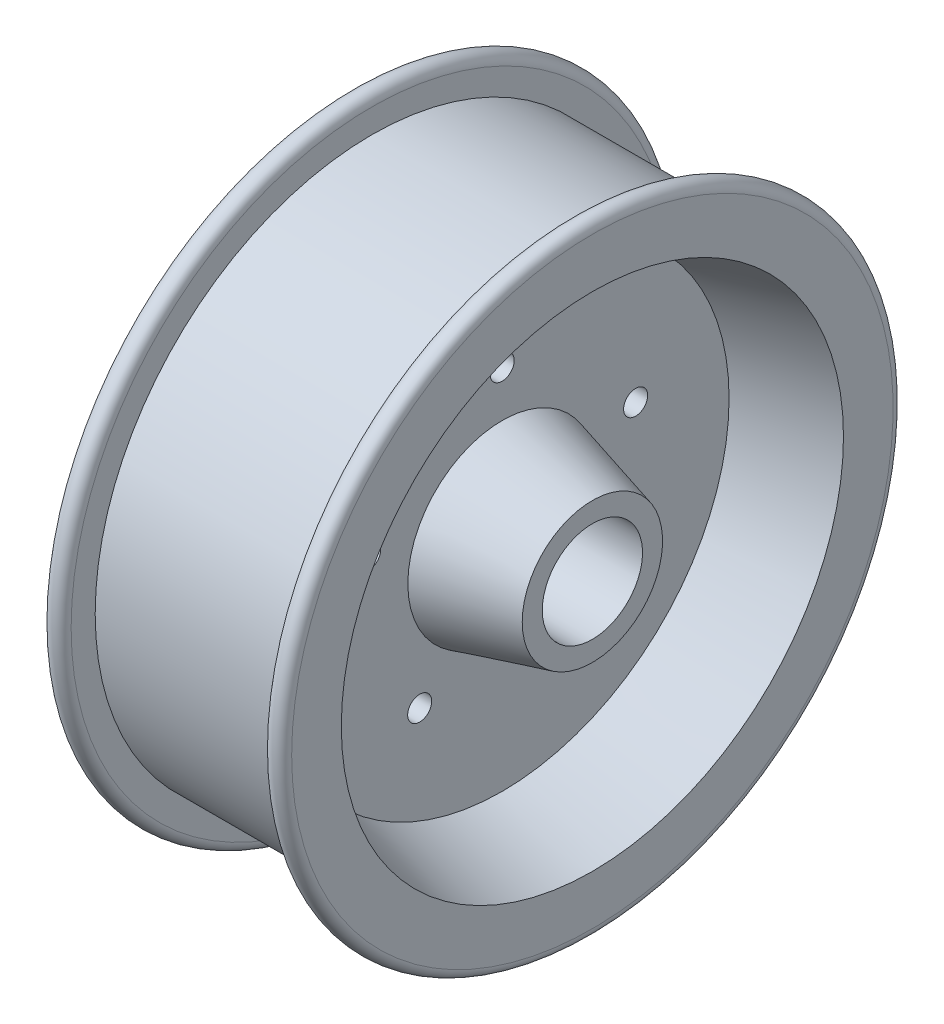
ISO-10303-21;
HEADER;
FILE_DESCRIPTION(('STEP AP214'),'2;1');
FILE_NAME('part.step','',(''),(''),'','','');
FILE_SCHEMA(('AUTOMOTIVE_DESIGN { 1 0 10303 214 1 1 1 1 }'));
ENDSEC;
DATA;
#1=APPLICATION_CONTEXT('core data for automotive mechanical design processes');
#2=APPLICATION_PROTOCOL_DEFINITION('international standard','automotive_design',2000,#1);
#3=PRODUCT_CONTEXT('',#1,'mechanical');
#4=PRODUCT('Part','Part','',(#3));
#5=PRODUCT_RELATED_PRODUCT_CATEGORY('part','',(#4));
#6=PRODUCT_DEFINITION_FORMATION('','',#4);
#7=PRODUCT_DEFINITION_CONTEXT('part definition',#1,'design');
#8=PRODUCT_DEFINITION('design','',#6,#7);
#9=PRODUCT_DEFINITION_SHAPE('','',#8);
#10=(LENGTH_UNIT() NAMED_UNIT(*) SI_UNIT(.MILLI.,.METRE.));
#11=(NAMED_UNIT(*) PLANE_ANGLE_UNIT() SI_UNIT($,.RADIAN.));
#12=(NAMED_UNIT(*) SI_UNIT($,.STERADIAN.) SOLID_ANGLE_UNIT());
#13=UNCERTAINTY_MEASURE_WITH_UNIT(LENGTH_MEASURE(1.E-05),#10,'distance_accuracy_value','');
#14=(GEOMETRIC_REPRESENTATION_CONTEXT(3) GLOBAL_UNCERTAINTY_ASSIGNED_CONTEXT((#13)) GLOBAL_UNIT_ASSIGNED_CONTEXT((#10,
#11,#12)) REPRESENTATION_CONTEXT('',''));
#15=CARTESIAN_POINT('',(0.,0.,0.));
#16=DIRECTION('',(0.,0.,1.));
#17=DIRECTION('',(1.,0.,0.));
#18=AXIS2_PLACEMENT_3D('',#15,#16,#17);
#19=CARTESIAN_POINT('',(-34.925,0.,0.));
#20=DIRECTION('',(-1.,0.,0.));
#21=DIRECTION('',(0.,0.,1.));
#22=AXIS2_PLACEMENT_3D('',#19,#20,#21);
#23=TOROIDAL_SURFACE('',#22,95.25,3.175);
#24=CARTESIAN_POINT('',(-31.75,0.,0.));
#25=DIRECTION('',(-1.,0.,0.));
#26=DIRECTION('',(0.,0.,1.));
#27=AXIS2_PLACEMENT_3D('',#24,#25,#26);
#28=CIRCLE('',#27,95.25);
#29=CARTESIAN_POINT('',(-31.75,0.,95.25));
#30=VERTEX_POINT('',#29);
#31=EDGE_CURVE('E108',#30,#30,#28,.T.);
#32=ORIENTED_EDGE('',*,*,#31,.T.);
#33=EDGE_LOOP('',(#32));
#34=FACE_BOUND('',#33,.T.);
#35=CARTESIAN_POINT('',(-38.1,0.,0.));
#36=DIRECTION('',(-1.,0.,0.));
#37=DIRECTION('',(0.,0.,1.));
#38=AXIS2_PLACEMENT_3D('',#35,#36,#37);
#39=CIRCLE('',#38,95.25);
#40=CARTESIAN_POINT('',(-38.1,0.,95.25));
#41=VERTEX_POINT('',#40);
#42=EDGE_CURVE('E10',#41,#41,#39,.T.);
#43=ORIENTED_EDGE('',*,*,#42,.F.);
#44=EDGE_LOOP('',(#43));
#45=FACE_BOUND('',#44,.T.);
#46=ADVANCED_FACE('F41',(#34,#45),#23,.T.);
#47=CARTESIAN_POINT('',(-38.1,0.,0.));
#48=DIRECTION('',(-1.,0.,0.));
#49=DIRECTION('',(0.,0.,1.));
#50=AXIS2_PLACEMENT_3D('',#47,#48,#49);
#51=PLANE('',#50);
#52=ORIENTED_EDGE('',*,*,#42,.T.);
#53=EDGE_LOOP('',(#52));
#54=FACE_BOUND('',#53,.T.);
#55=CARTESIAN_POINT('',(-38.1,0.,0.));
#56=DIRECTION('',(-1.,0.,0.));
#57=DIRECTION('',(0.,0.,1.));
#58=AXIS2_PLACEMENT_3D('',#55,#56,#57);
#59=CIRCLE('',#58,79.5274);
#60=CARTESIAN_POINT('',(-38.1,0.,79.5274));
#61=VERTEX_POINT('',#60);
#62=EDGE_CURVE('E48',#61,#61,#59,.T.);
#63=ORIENTED_EDGE('',*,*,#62,.F.);
#64=EDGE_LOOP('',(#63));
#65=FACE_BOUND('',#64,.T.);
#66=ADVANCED_FACE('F202',(#54,#65),#51,.T.);
#67=CARTESIAN_POINT('',(-9.52500000000001,0.,0.));
#68=DIRECTION('',(-1.,0.,0.));
#69=DIRECTION('',(0.,0.,1.));
#70=AXIS2_PLACEMENT_3D('',#67,#68,#69);
#71=CONICAL_SURFACE('',#70,71.8707518262806,0.26179938779915);
#72=ORIENTED_EDGE('',*,*,#62,.T.);
#73=EDGE_LOOP('',(#72));
#74=FACE_BOUND('',#73,.T.);
#75=CARTESIAN_POINT('',(-9.52500000000001,0.,0.));
#76=DIRECTION('',(-1.,0.,0.));
#77=DIRECTION('',(0.,0.,1.));
#78=AXIS2_PLACEMENT_3D('',#75,#76,#77);
#79=CIRCLE('',#78,71.8707518262806);
#80=CARTESIAN_POINT('',(-9.52500000000001,0.,71.8707518262806));
#81=VERTEX_POINT('',#80);
#82=EDGE_CURVE('E53',#81,#81,#79,.T.);
#83=ORIENTED_EDGE('',*,*,#82,.F.);
#84=EDGE_LOOP('',(#83));
#85=FACE_BOUND('',#84,.T.);
#86=ADVANCED_FACE('F207',(#74,#85),#71,.F.);
#87=CARTESIAN_POINT('',(-9.525,0.,0.));
#88=DIRECTION('',(-1.,0.,0.));
#89=DIRECTION('',(0.,0.,1.));
#90=AXIS2_PLACEMENT_3D('',#87,#88,#89);
#91=PLANE('',#90);
#92=CARTESIAN_POINT('',(-9.525,44.45,0.));
#93=DIRECTION('',(-1.,0.,0.));
#94=DIRECTION('',(0.,0.,1.));
#95=AXIS2_PLACEMENT_3D('',#92,#93,#94);
#96=CIRCLE('',#95,3.81);
#97=CARTESIAN_POINT('',(-9.525,44.45,3.81));
#98=VERTEX_POINT('',#97);
#99=EDGE_CURVE('E112',#98,#98,#96,.T.);
#100=ORIENTED_EDGE('',*,*,#99,.F.);
#101=EDGE_LOOP('',(#100));
#102=FACE_BOUND('',#101,.T.);
#103=CARTESIAN_POINT('',(-9.525,13.7358053999664,-42.2744621493196));
#104=DIRECTION('',(-1.,0.,0.));
#105=DIRECTION('',(0.,0.,1.));
#106=AXIS2_PLACEMENT_3D('',#103,#104,#105);
#107=CIRCLE('',#106,3.81);
#108=CARTESIAN_POINT('',(-9.525,13.7358053999664,-38.4644621493196));
#109=VERTEX_POINT('',#108);
#110=EDGE_CURVE('E116',#109,#109,#107,.T.);
#111=ORIENTED_EDGE('',*,*,#110,.F.);
#112=EDGE_LOOP('',(#111));
#113=FACE_BOUND('',#112,.T.);
#114=CARTESIAN_POINT('',(-9.525,-35.9608053999664,-26.1270544644004));
#115=DIRECTION('',(-1.,0.,0.));
#116=DIRECTION('',(0.,0.,1.));
#117=AXIS2_PLACEMENT_3D('',#114,#115,#116);
#118=CIRCLE('',#117,3.81);
#119=CARTESIAN_POINT('',(-9.525,-35.9608053999664,-22.3170544644004));
#120=VERTEX_POINT('',#119);
#121=EDGE_CURVE('E120',#120,#120,#118,.T.);
#122=ORIENTED_EDGE('',*,*,#121,.F.);
#123=EDGE_LOOP('',(#122));
#124=FACE_BOUND('',#123,.T.);
#125=CARTESIAN_POINT('',(-9.525,-35.9608053999664,26.1270544644004));
#126=DIRECTION('',(-1.,0.,0.));
#127=DIRECTION('',(0.,0.,1.));
#128=AXIS2_PLACEMENT_3D('',#125,#126,#127);
#129=CIRCLE('',#128,3.81);
#130=CARTESIAN_POINT('',(-9.525,-35.9608053999664,29.9370544644004));
#131=VERTEX_POINT('',#130);
#132=EDGE_CURVE('E124',#131,#131,#129,.T.);
#133=ORIENTED_EDGE('',*,*,#132,.F.);
#134=EDGE_LOOP('',(#133));
#135=FACE_BOUND('',#134,.T.);
#136=CARTESIAN_POINT('',(-9.525,13.7358053999664,42.2744621493196));
#137=DIRECTION('',(-1.,0.,0.));
#138=DIRECTION('',(0.,0.,1.));
#139=AXIS2_PLACEMENT_3D('',#136,#137,#138);
#140=CIRCLE('',#139,3.80999999999999);
#141=CARTESIAN_POINT('',(-9.525,13.7358053999664,46.0844621493196));
#142=VERTEX_POINT('',#141);
#143=EDGE_CURVE('E128',#142,#142,#140,.T.);
#144=ORIENTED_EDGE('',*,*,#143,.F.);
#145=EDGE_LOOP('',(#144));
#146=FACE_BOUND('',#145,.T.);
#147=ORIENTED_EDGE('',*,*,#82,.T.);
#148=EDGE_LOOP('',(#147));
#149=FACE_BOUND('',#148,.T.);
#150=CARTESIAN_POINT('',(-9.52499999999999,0.,0.));
#151=DIRECTION('',(-1.,0.,0.));
#152=DIRECTION('',(0.,0.,1.));
#153=AXIS2_PLACEMENT_3D('',#150,#151,#152);
#154=CIRCLE('',#153,29.8816481737194);
#155=CARTESIAN_POINT('',(-9.52499999999999,0.,29.8816481737194));
#156=VERTEX_POINT('',#155);
#157=EDGE_CURVE('E58',#156,#156,#154,.T.);
#158=ORIENTED_EDGE('',*,*,#157,.F.);
#159=EDGE_LOOP('',(#158));
#160=FACE_BOUND('',#159,.T.);
#161=ADVANCED_FACE('F198',(#102,#113,#124,#135,#146,#149,#160),#91,.T.);
#162=CARTESIAN_POINT('',(-38.1,0.,0.));
#163=DIRECTION('',(1.,0.,0.));
#164=DIRECTION('',(0.,0.,-1.));
#165=AXIS2_PLACEMENT_3D('',#162,#163,#164);
#166=CONICAL_SURFACE('',#165,22.225,0.26179938779915);
#167=ORIENTED_EDGE('',*,*,#157,.T.);
#168=EDGE_LOOP('',(#167));
#169=FACE_BOUND('',#168,.T.);
#170=CARTESIAN_POINT('',(-38.1,0.,0.));
#171=DIRECTION('',(-1.,0.,0.));
#172=DIRECTION('',(0.,0.,1.));
#173=AXIS2_PLACEMENT_3D('',#170,#171,#172);
#174=CIRCLE('',#173,22.225);
#175=CARTESIAN_POINT('',(-38.1,0.,22.225));
#176=VERTEX_POINT('',#175);
#177=EDGE_CURVE('E64',#176,#176,#174,.T.);
#178=ORIENTED_EDGE('',*,*,#177,.F.);
#179=EDGE_LOOP('',(#178));
#180=FACE_BOUND('',#179,.T.);
#181=ADVANCED_FACE('F192',(#169,#180),#166,.T.);
#182=CARTESIAN_POINT('',(-38.1,0.,0.));
#183=DIRECTION('',(-1.,0.,0.));
#184=DIRECTION('',(0.,0.,1.));
#185=AXIS2_PLACEMENT_3D('',#182,#183,#184);
#186=PLANE('',#185);
#187=ORIENTED_EDGE('',*,*,#177,.T.);
#188=EDGE_LOOP('',(#187));
#189=FACE_BOUND('',#188,.T.);
#190=CARTESIAN_POINT('',(-38.1,0.,0.));
#191=DIRECTION('',(-1.,0.,0.));
#192=DIRECTION('',(0.,0.,1.));
#193=AXIS2_PLACEMENT_3D('',#190,#191,#192);
#194=CIRCLE('',#193,15.875);
#195=CARTESIAN_POINT('',(-38.1,0.,15.875));
#196=VERTEX_POINT('',#195);
#197=EDGE_CURVE('E68',#196,#196,#194,.T.);
#198=ORIENTED_EDGE('',*,*,#197,.F.);
#199=EDGE_LOOP('',(#198));
#200=FACE_BOUND('',#199,.T.);
#201=ADVANCED_FACE('F187',(#189,#200),#186,.T.);
#202=CARTESIAN_POINT('',(-74.7676691729323,0.,0.));
#203=DIRECTION('',(-1.,0.,0.));
#204=DIRECTION('',(0.,0.,1.));
#205=AXIS2_PLACEMENT_3D('',#202,#203,#204);
#206=CYLINDRICAL_SURFACE('',#205,15.875);
#207=CARTESIAN_POINT('',(38.1,0.,0.));
#208=DIRECTION('',(-1.,0.,0.));
#209=DIRECTION('',(0.,0.,1.));
#210=AXIS2_PLACEMENT_3D('',#207,#208,#209);
#211=CIRCLE('',#210,15.875);
#212=CARTESIAN_POINT('',(38.1,0.,15.875));
#213=VERTEX_POINT('',#212);
#214=EDGE_CURVE('E72',#213,#213,#211,.T.);
#215=ORIENTED_EDGE('',*,*,#214,.F.);
#216=EDGE_LOOP('',(#215));
#217=FACE_BOUND('',#216,.T.);
#218=ORIENTED_EDGE('',*,*,#197,.T.);
#219=EDGE_LOOP('',(#218));
#220=FACE_BOUND('',#219,.T.);
#221=ADVANCED_FACE('F181',(#217,#220),#206,.F.);
#222=CARTESIAN_POINT('',(38.1,0.,0.));
#223=DIRECTION('',(-1.,0.,0.));
#224=DIRECTION('',(0.,0.,1.));
#225=AXIS2_PLACEMENT_3D('',#222,#223,#224);
#226=PLANE('',#225);
#227=CARTESIAN_POINT('',(38.1,0.,0.));
#228=DIRECTION('',(-1.,0.,0.));
#229=DIRECTION('',(0.,0.,1.));
#230=AXIS2_PLACEMENT_3D('',#227,#228,#229);
#231=CIRCLE('',#230,22.225);
#232=CARTESIAN_POINT('',(38.1,0.,22.225));
#233=VERTEX_POINT('',#232);
#234=EDGE_CURVE('E76',#233,#233,#231,.T.);
#235=ORIENTED_EDGE('',*,*,#234,.F.);
#236=EDGE_LOOP('',(#235));
#237=FACE_BOUND('',#236,.T.);
#238=ORIENTED_EDGE('',*,*,#214,.T.);
#239=EDGE_LOOP('',(#238));
#240=FACE_BOUND('',#239,.T.);
#241=ADVANCED_FACE('F175',(#237,#240),#226,.F.);
#242=CARTESIAN_POINT('',(38.1,0.,0.));
#243=DIRECTION('',(-1.,0.,0.));
#244=DIRECTION('',(0.,0.,1.));
#245=AXIS2_PLACEMENT_3D('',#242,#243,#244);
#246=CONICAL_SURFACE('',#245,22.225,0.26179938779915);
#247=CARTESIAN_POINT('',(9.52500000000001,0.,0.));
#248=DIRECTION('',(-1.,0.,0.));
#249=DIRECTION('',(0.,0.,1.));
#250=AXIS2_PLACEMENT_3D('',#247,#248,#249);
#251=CIRCLE('',#250,29.8816481737194);
#252=CARTESIAN_POINT('',(9.52500000000001,0.,29.8816481737194));
#253=VERTEX_POINT('',#252);
#254=EDGE_CURVE('E80',#253,#253,#251,.T.);
#255=ORIENTED_EDGE('',*,*,#254,.F.);
#256=EDGE_LOOP('',(#255));
#257=FACE_BOUND('',#256,.T.);
#258=ORIENTED_EDGE('',*,*,#234,.T.);
#259=EDGE_LOOP('',(#258));
#260=FACE_BOUND('',#259,.T.);
#261=ADVANCED_FACE('F159',(#257,#260),#246,.T.);
#262=CARTESIAN_POINT('',(9.52500000000001,0.,0.));
#263=DIRECTION('',(-1.,0.,0.));
#264=DIRECTION('',(0.,0.,1.));
#265=AXIS2_PLACEMENT_3D('',#262,#263,#264);
#266=PLANE('',#265);
#267=CARTESIAN_POINT('',(9.52500000000001,44.45,0.));
#268=DIRECTION('',(1.,0.,0.));
#269=DIRECTION('',(0.,0.,-1.));
#270=AXIS2_PLACEMENT_3D('',#267,#268,#269);
#271=CIRCLE('',#270,3.81);
#272=CARTESIAN_POINT('',(9.52500000000001,44.45,-3.81));
#273=VERTEX_POINT('',#272);
#274=EDGE_CURVE('E132',#273,#273,#271,.T.);
#275=ORIENTED_EDGE('',*,*,#274,.F.);
#276=EDGE_LOOP('',(#275));
#277=FACE_BOUND('',#276,.T.);
#278=CARTESIAN_POINT('',(9.52500000000001,13.7358053999664,-42.2744621493196));
#279=DIRECTION('',(1.,0.,0.));
#280=DIRECTION('',(0.,0.,-1.));
#281=AXIS2_PLACEMENT_3D('',#278,#279,#280);
#282=CIRCLE('',#281,3.81);
#283=CARTESIAN_POINT('',(9.52500000000001,13.7358053999664,-46.0844621493196));
#284=VERTEX_POINT('',#283);
#285=EDGE_CURVE('E145',#284,#284,#282,.T.);
#286=ORIENTED_EDGE('',*,*,#285,.F.);
#287=EDGE_LOOP('',(#286));
#288=FACE_BOUND('',#287,.T.);
#289=CARTESIAN_POINT('',(9.52500000000001,-35.9608053999664,-26.1270544644004));
#290=DIRECTION('',(1.,0.,0.));
#291=DIRECTION('',(0.,0.,-1.));
#292=AXIS2_PLACEMENT_3D('',#289,#290,#291);
#293=CIRCLE('',#292,3.81);
#294=CARTESIAN_POINT('',(9.52500000000001,-35.9608053999664,-29.9370544644004));
#295=VERTEX_POINT('',#294);
#296=EDGE_CURVE('E141',#295,#295,#293,.T.);
#297=ORIENTED_EDGE('',*,*,#296,.F.);
#298=EDGE_LOOP('',(#297));
#299=FACE_BOUND('',#298,.T.);
#300=CARTESIAN_POINT('',(9.52500000000001,-35.9608053999664,26.1270544644004));
#301=DIRECTION('',(1.,0.,0.));
#302=DIRECTION('',(0.,0.,-1.));
#303=AXIS2_PLACEMENT_3D('',#300,#301,#302);
#304=CIRCLE('',#303,3.81);
#305=CARTESIAN_POINT('',(9.52500000000001,-35.9608053999664,22.3170544644004));
#306=VERTEX_POINT('',#305);
#307=EDGE_CURVE('E137',#306,#306,#304,.T.);
#308=ORIENTED_EDGE('',*,*,#307,.F.);
#309=EDGE_LOOP('',(#308));
#310=FACE_BOUND('',#309,.T.);
#311=CARTESIAN_POINT('',(9.52500000000001,13.7358053999664,42.2744621493196));
#312=DIRECTION('',(1.,0.,0.));
#313=DIRECTION('',(0.,0.,-1.));
#314=AXIS2_PLACEMENT_3D('',#311,#312,#313);
#315=CIRCLE('',#314,3.80999999999999);
#316=CARTESIAN_POINT('',(9.52500000000001,13.7358053999664,38.4644621493196));
#317=VERTEX_POINT('',#316);
#318=EDGE_CURVE('E133',#317,#317,#315,.T.);
#319=ORIENTED_EDGE('',*,*,#318,.F.);
#320=EDGE_LOOP('',(#319));
#321=FACE_BOUND('',#320,.T.);
#322=CARTESIAN_POINT('',(9.52500000000001,0.,0.));
#323=DIRECTION('',(-1.,0.,0.));
#324=DIRECTION('',(0.,0.,1.));
#325=AXIS2_PLACEMENT_3D('',#322,#323,#324);
#326=CIRCLE('',#325,71.8707518262807);
#327=CARTESIAN_POINT('',(9.52500000000001,0.,71.8707518262807));
#328=VERTEX_POINT('',#327);
#329=EDGE_CURVE('E84',#328,#328,#326,.T.);
#330=ORIENTED_EDGE('',*,*,#329,.F.);
#331=EDGE_LOOP('',(#330));
#332=FACE_BOUND('',#331,.T.);
#333=ORIENTED_EDGE('',*,*,#254,.T.);
#334=EDGE_LOOP('',(#333));
#335=FACE_BOUND('',#334,.T.);
#336=ADVANCED_FACE('F155',(#277,#288,#299,#310,#321,#332,#335),#266,.F.);
#337=CARTESIAN_POINT('',(9.52500000000001,0.,0.));
#338=DIRECTION('',(1.,0.,0.));
#339=DIRECTION('',(0.,0.,-1.));
#340=AXIS2_PLACEMENT_3D('',#337,#338,#339);
#341=CONICAL_SURFACE('',#340,71.8707518262807,0.26179938779915);
#342=CARTESIAN_POINT('',(38.1,0.,0.));
#343=DIRECTION('',(-1.,0.,0.));
#344=DIRECTION('',(0.,0.,1.));
#345=AXIS2_PLACEMENT_3D('',#342,#343,#344);
#346=CIRCLE('',#345,79.5274);
#347=CARTESIAN_POINT('',(38.1,0.,79.5274));
#348=VERTEX_POINT('',#347);
#349=EDGE_CURVE('E88',#348,#348,#346,.T.);
#350=ORIENTED_EDGE('',*,*,#349,.F.);
#351=EDGE_LOOP('',(#350));
#352=FACE_BOUND('',#351,.T.);
#353=ORIENTED_EDGE('',*,*,#329,.T.);
#354=EDGE_LOOP('',(#353));
#355=FACE_BOUND('',#354,.T.);
#356=ADVANCED_FACE('F158',(#352,#355),#341,.F.);
#357=CARTESIAN_POINT('',(38.1,0.,0.));
#358=DIRECTION('',(-1.,0.,0.));
#359=DIRECTION('',(0.,0.,1.));
#360=AXIS2_PLACEMENT_3D('',#357,#358,#359);
#361=PLANE('',#360);
#362=CARTESIAN_POINT('',(38.1,0.,0.));
#363=DIRECTION('',(-1.,0.,0.));
#364=DIRECTION('',(0.,0.,1.));
#365=AXIS2_PLACEMENT_3D('',#362,#363,#364);
#366=CIRCLE('',#365,95.25);
#367=CARTESIAN_POINT('',(38.1,0.,95.25));
#368=VERTEX_POINT('',#367);
#369=EDGE_CURVE('E92',#368,#368,#366,.T.);
#370=ORIENTED_EDGE('',*,*,#369,.F.);
#371=EDGE_LOOP('',(#370));
#372=FACE_BOUND('',#371,.T.);
#373=ORIENTED_EDGE('',*,*,#349,.T.);
#374=EDGE_LOOP('',(#373));
#375=FACE_BOUND('',#374,.T.);
#376=ADVANCED_FACE('F235',(#372,#375),#361,.F.);
#377=CARTESIAN_POINT('',(34.925,0.,0.));
#378=DIRECTION('',(-1.,0.,0.));
#379=DIRECTION('',(0.,0.,1.));
#380=AXIS2_PLACEMENT_3D('',#377,#378,#379);
#381=TOROIDAL_SURFACE('',#380,95.25,3.175);
#382=CARTESIAN_POINT('',(31.75,0.,0.));
#383=DIRECTION('',(-1.,0.,0.));
#384=DIRECTION('',(0.,0.,1.));
#385=AXIS2_PLACEMENT_3D('',#382,#383,#384);
#386=CIRCLE('',#385,95.25);
#387=CARTESIAN_POINT('',(31.75,0.,95.25));
#388=VERTEX_POINT('',#387);
#389=EDGE_CURVE('E96',#388,#388,#386,.T.);
#390=ORIENTED_EDGE('',*,*,#389,.F.);
#391=EDGE_LOOP('',(#390));
#392=FACE_BOUND('',#391,.T.);
#393=ORIENTED_EDGE('',*,*,#369,.T.);
#394=EDGE_LOOP('',(#393));
#395=FACE_BOUND('',#394,.T.);
#396=ADVANCED_FACE('F231',(#392,#395),#381,.T.);
#397=CARTESIAN_POINT('',(31.75,0.,0.));
#398=DIRECTION('',(1.,0.,0.));
#399=DIRECTION('',(0.,0.,-1.));
#400=AXIS2_PLACEMENT_3D('',#397,#398,#399);
#401=PLANE('',#400);
#402=CARTESIAN_POINT('',(31.75,0.,0.));
#403=DIRECTION('',(-1.,0.,0.));
#404=DIRECTION('',(0.,0.,1.));
#405=AXIS2_PLACEMENT_3D('',#402,#403,#404);
#406=CIRCLE('',#405,87.63);
#407=CARTESIAN_POINT('',(31.75,0.,87.63));
#408=VERTEX_POINT('',#407);
#409=EDGE_CURVE('E100',#408,#408,#406,.T.);
#410=ORIENTED_EDGE('',*,*,#409,.F.);
#411=EDGE_LOOP('',(#410));
#412=FACE_BOUND('',#411,.T.);
#413=ORIENTED_EDGE('',*,*,#389,.T.);
#414=EDGE_LOOP('',(#413));
#415=FACE_BOUND('',#414,.T.);
#416=ADVANCED_FACE('F224',(#412,#415),#401,.F.);
#417=CARTESIAN_POINT('',(-74.7676691729323,0.,0.));
#418=DIRECTION('',(-1.,0.,0.));
#419=DIRECTION('',(0.,0.,1.));
#420=AXIS2_PLACEMENT_3D('',#417,#418,#419);
#421=CYLINDRICAL_SURFACE('',#420,87.63);
#422=CARTESIAN_POINT('',(-31.75,0.,0.));
#423=DIRECTION('',(-1.,0.,0.));
#424=DIRECTION('',(0.,0.,1.));
#425=AXIS2_PLACEMENT_3D('',#422,#423,#424);
#426=CIRCLE('',#425,87.63);
#427=CARTESIAN_POINT('',(-31.75,0.,87.63));
#428=VERTEX_POINT('',#427);
#429=EDGE_CURVE('E104',#428,#428,#426,.T.);
#430=ORIENTED_EDGE('',*,*,#429,.F.);
#431=EDGE_LOOP('',(#430));
#432=FACE_BOUND('',#431,.T.);
#433=ORIENTED_EDGE('',*,*,#409,.T.);
#434=EDGE_LOOP('',(#433));
#435=FACE_BOUND('',#434,.T.);
#436=ADVANCED_FACE('F214',(#432,#435),#421,.T.);
#437=CARTESIAN_POINT('',(-31.75,0.,0.));
#438=DIRECTION('',(1.,0.,0.));
#439=DIRECTION('',(0.,0.,-1.));
#440=AXIS2_PLACEMENT_3D('',#437,#438,#439);
#441=PLANE('',#440);
#442=ORIENTED_EDGE('',*,*,#429,.T.);
#443=EDGE_LOOP('',(#442));
#444=FACE_BOUND('',#443,.T.);
#445=ORIENTED_EDGE('',*,*,#31,.F.);
#446=EDGE_LOOP('',(#445));
#447=FACE_BOUND('',#446,.T.);
#448=ADVANCED_FACE('F211',(#444,#447),#441,.T.);
#449=CARTESIAN_POINT('',(-38.1,13.7358053999664,42.2744621493196));
#450=DIRECTION('',(1.,0.,0.));
#451=DIRECTION('',(0.,0.,-1.));
#452=AXIS2_PLACEMENT_3D('',#449,#450,#451);
#453=CYLINDRICAL_SURFACE('',#452,3.80999999999999);
#454=ORIENTED_EDGE('',*,*,#143,.T.);
#455=EDGE_LOOP('',(#454));
#456=FACE_BOUND('',#455,.T.);
#457=ORIENTED_EDGE('',*,*,#318,.T.);
#458=EDGE_LOOP('',(#457));
#459=FACE_BOUND('',#458,.T.);
#460=ADVANCED_FACE('F213',(#456,#459),#453,.F.);
#461=CARTESIAN_POINT('',(-38.1,-35.9608053999664,26.1270544644004));
#462=DIRECTION('',(1.,0.,0.));
#463=DIRECTION('',(0.,0.,-1.));
#464=AXIS2_PLACEMENT_3D('',#461,#462,#463);
#465=CYLINDRICAL_SURFACE('',#464,3.81);
#466=ORIENTED_EDGE('',*,*,#132,.T.);
#467=EDGE_LOOP('',(#466));
#468=FACE_BOUND('',#467,.T.);
#469=ORIENTED_EDGE('',*,*,#307,.T.);
#470=EDGE_LOOP('',(#469));
#471=FACE_BOUND('',#470,.T.);
#472=ADVANCED_FACE('F221',(#468,#471),#465,.F.);
#473=CARTESIAN_POINT('',(-38.1,-35.9608053999664,-26.1270544644004));
#474=DIRECTION('',(1.,0.,0.));
#475=DIRECTION('',(0.,0.,-1.));
#476=AXIS2_PLACEMENT_3D('',#473,#474,#475);
#477=CYLINDRICAL_SURFACE('',#476,3.81);
#478=ORIENTED_EDGE('',*,*,#121,.T.);
#479=EDGE_LOOP('',(#478));
#480=FACE_BOUND('',#479,.T.);
#481=ORIENTED_EDGE('',*,*,#296,.T.);
#482=EDGE_LOOP('',(#481));
#483=FACE_BOUND('',#482,.T.);
#484=ADVANCED_FACE('F307',(#480,#483),#477,.F.);
#485=CARTESIAN_POINT('',(-38.1,13.7358053999664,-42.2744621493196));
#486=DIRECTION('',(1.,0.,0.));
#487=DIRECTION('',(0.,0.,-1.));
#488=AXIS2_PLACEMENT_3D('',#485,#486,#487);
#489=CYLINDRICAL_SURFACE('',#488,3.81);
#490=ORIENTED_EDGE('',*,*,#110,.T.);
#491=EDGE_LOOP('',(#490));
#492=FACE_BOUND('',#491,.T.);
#493=ORIENTED_EDGE('',*,*,#285,.T.);
#494=EDGE_LOOP('',(#493));
#495=FACE_BOUND('',#494,.T.);
#496=ADVANCED_FACE('F317',(#492,#495),#489,.F.);
#497=CARTESIAN_POINT('',(-38.1,44.45,0.));
#498=DIRECTION('',(1.,0.,0.));
#499=DIRECTION('',(0.,0.,-1.));
#500=AXIS2_PLACEMENT_3D('',#497,#498,#499);
#501=CYLINDRICAL_SURFACE('',#500,3.81);
#502=ORIENTED_EDGE('',*,*,#99,.T.);
#503=EDGE_LOOP('',(#502));
#504=FACE_BOUND('',#503,.T.);
#505=ORIENTED_EDGE('',*,*,#274,.T.);
#506=EDGE_LOOP('',(#505));
#507=FACE_BOUND('',#506,.T.);
#508=ADVANCED_FACE('F153',(#504,#507),#501,.F.);
#509=CLOSED_SHELL('',(#46,#66,#86,#161,#181,#201,#221,#241,#261,#336,#356,#376,#396,#416,#436,
#448,#460,#472,#484,#496,#508));
#510=MANIFOLD_SOLID_BREP('B2',#509);
#511=ADVANCED_BREP_SHAPE_REPRESENTATION('',(#18,#510),#14);
#512=SHAPE_DEFINITION_REPRESENTATION(#9,#511);
ENDSEC;
END-ISO-10303-21;
